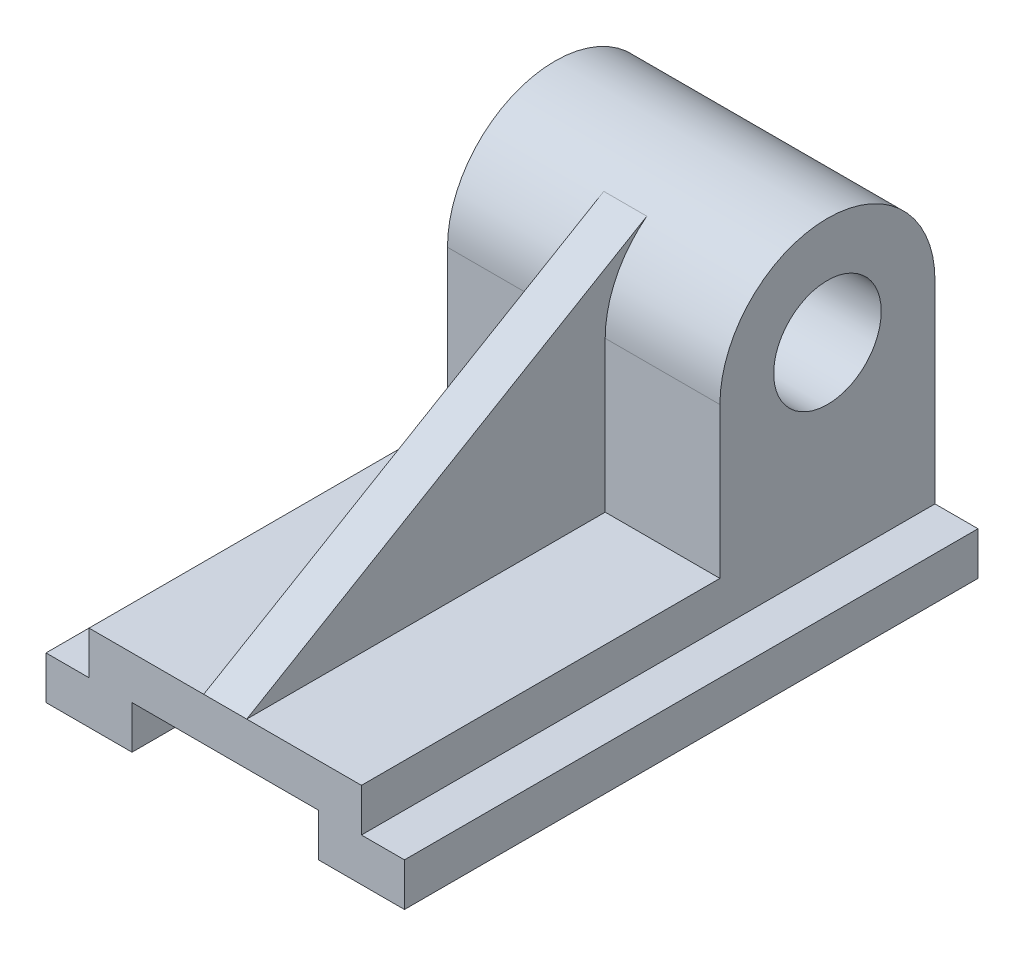
ISO-10303-21;
HEADER;
FILE_DESCRIPTION(('STEP AP214'),'2;1');
FILE_NAME('part.step','',(''),(''),'','','');
FILE_SCHEMA(('AUTOMOTIVE_DESIGN { 1 0 10303 214 1 1 1 1 }'));
ENDSEC;
DATA;
#1=APPLICATION_CONTEXT('core data for automotive mechanical design processes');
#2=APPLICATION_PROTOCOL_DEFINITION('international standard','automotive_design',2000,#1);
#3=PRODUCT_CONTEXT('',#1,'mechanical');
#4=PRODUCT('Part','Part','',(#3));
#5=PRODUCT_RELATED_PRODUCT_CATEGORY('part','',(#4));
#6=PRODUCT_DEFINITION_FORMATION('','',#4);
#7=PRODUCT_DEFINITION_CONTEXT('part definition',#1,'design');
#8=PRODUCT_DEFINITION('design','',#6,#7);
#9=PRODUCT_DEFINITION_SHAPE('','',#8);
#10=(LENGTH_UNIT() NAMED_UNIT(*) SI_UNIT(.MILLI.,.METRE.));
#11=(NAMED_UNIT(*) PLANE_ANGLE_UNIT() SI_UNIT($,.RADIAN.));
#12=(NAMED_UNIT(*) SI_UNIT($,.STERADIAN.) SOLID_ANGLE_UNIT());
#13=UNCERTAINTY_MEASURE_WITH_UNIT(LENGTH_MEASURE(1.E-05),#10,'distance_accuracy_value','');
#14=(GEOMETRIC_REPRESENTATION_CONTEXT(3) GLOBAL_UNCERTAINTY_ASSIGNED_CONTEXT((#13)) GLOBAL_UNIT_ASSIGNED_CONTEXT((#10,
#11,#12)) REPRESENTATION_CONTEXT('',''));
#15=CARTESIAN_POINT('',(0.,0.,0.));
#16=DIRECTION('',(0.,0.,1.));
#17=DIRECTION('',(1.,0.,0.));
#18=AXIS2_PLACEMENT_3D('',#15,#16,#17);
#19=CARTESIAN_POINT('',(0.,180.,-800.));
#20=DIRECTION('',(0.,-1.,0.));
#21=DIRECTION('',(0.,0.,-1.));
#22=AXIS2_PLACEMENT_3D('',#19,#20,#21);
#23=PLANE('',#22);
#24=DIRECTION('',(0.,0.,1.));
#25=VECTOR('',#24,1.);
#26=CARTESIAN_POINT('',(-60.,180.,-800.));
#27=LINE('',#26,#25);
#28=CARTESIAN_POINT('',(-60.0000000000001,180.,-200.));
#29=VERTEX_POINT('',#28);
#30=CARTESIAN_POINT('',(-60.,180.,800.));
#31=VERTEX_POINT('',#30);
#32=EDGE_CURVE('E158',#29,#31,#27,.T.);
#33=ORIENTED_EDGE('',*,*,#32,.F.);
#34=DIRECTION('',(1.,0.,0.));
#35=VECTOR('',#34,1.);
#36=CARTESIAN_POINT('',(-1317.2299611088,180.,-200.));
#37=LINE('',#36,#35);
#38=CARTESIAN_POINT('',(-380.,180.,-200.));
#39=VERTEX_POINT('',#38);
#40=EDGE_CURVE('E58',#39,#29,#37,.T.);
#41=ORIENTED_EDGE('',*,*,#40,.F.);
#42=DIRECTION('',(0.,0.,1.));
#43=VECTOR('',#42,1.);
#44=CARTESIAN_POINT('',(-380.,180.,-800.));
#45=LINE('',#44,#43);
#46=CARTESIAN_POINT('',(-380.,180.,800.));
#47=VERTEX_POINT('',#46);
#48=EDGE_CURVE('E186',#39,#47,#45,.T.);
#49=ORIENTED_EDGE('',*,*,#48,.T.);
#50=DIRECTION('',(1.,0.,0.));
#51=VECTOR('',#50,1.);
#52=CARTESIAN_POINT('',(0.,180.,800.));
#53=LINE('',#52,#51);
#54=EDGE_CURVE('E180',#47,#31,#53,.T.);
#55=ORIENTED_EDGE('',*,*,#54,.T.);
#56=EDGE_LOOP('',(#33,#41,#49,#55));
#57=FACE_BOUND('',#56,.T.);
#58=ADVANCED_FACE('F35',(#57),#23,.F.);
#59=CARTESIAN_POINT('',(-1317.2299611088,600.,-200.));
#60=DIRECTION('',(0.,0.,1.));
#61=DIRECTION('',(1.,0.,0.));
#62=AXIS2_PLACEMENT_3D('',#59,#60,#61);
#63=PLANE('',#62);
#64=ORIENTED_EDGE('',*,*,#40,.T.);
#65=DIRECTION('',(0.,1.,0.));
#66=VECTOR('',#65,1.);
#67=CARTESIAN_POINT('',(-60.0000000000001,600.,-200.));
#68=LINE('',#67,#66);
#69=CARTESIAN_POINT('',(-60.0000000000001,600.,-200.));
#70=VERTEX_POINT('',#69);
#71=EDGE_CURVE('E162',#29,#70,#68,.T.);
#72=ORIENTED_EDGE('',*,*,#71,.T.);
#73=DIRECTION('',(1.,0.,0.));
#74=VECTOR('',#73,1.);
#75=CARTESIAN_POINT('',(-1317.2299611088,600.,-200.));
#76=LINE('',#75,#74);
#77=CARTESIAN_POINT('',(-380.,600.,-200.));
#78=VERTEX_POINT('',#77);
#79=EDGE_CURVE('E340',#78,#70,#76,.T.);
#80=ORIENTED_EDGE('',*,*,#79,.F.);
#81=DIRECTION('',(0.,1.,0.));
#82=VECTOR('',#81,1.);
#83=CARTESIAN_POINT('',(-380.,600.,-200.));
#84=LINE('',#83,#82);
#85=EDGE_CURVE('E261',#39,#78,#84,.T.);
#86=ORIENTED_EDGE('',*,*,#85,.F.);
#87=EDGE_LOOP('',(#64,#72,#80,#86));
#88=FACE_BOUND('',#87,.T.);
#89=ADVANCED_FACE('F368',(#88),#63,.T.);
#90=CARTESIAN_POINT('',(60.0000000000001,180.,-200.));
#91=VERTEX_POINT('',#90);
#92=CARTESIAN_POINT('',(380.,180.,-200.));
#93=VERTEX_POINT('',#92);
#94=EDGE_CURVE('E348',#91,#93,#37,.T.);
#95=ORIENTED_EDGE('',*,*,#94,.F.);
#96=DIRECTION('',(0.,0.,1.));
#97=VECTOR('',#96,1.);
#98=CARTESIAN_POINT('',(60.,180.,-800.));
#99=LINE('',#98,#97);
#100=CARTESIAN_POINT('',(60.,180.,800.));
#101=VERTEX_POINT('',#100);
#102=EDGE_CURVE('E184',#91,#101,#99,.T.);
#103=ORIENTED_EDGE('',*,*,#102,.T.);
#104=CARTESIAN_POINT('',(380.,180.,800.));
#105=VERTEX_POINT('',#104);
#106=EDGE_CURVE('E182',#101,#105,#53,.T.);
#107=ORIENTED_EDGE('',*,*,#106,.T.);
#108=DIRECTION('',(0.,0.,1.));
#109=VECTOR('',#108,1.);
#110=CARTESIAN_POINT('',(380.,180.,-800.));
#111=LINE('',#110,#109);
#112=EDGE_CURVE('E239',#93,#105,#111,.T.);
#113=ORIENTED_EDGE('',*,*,#112,.F.);
#114=EDGE_LOOP('',(#95,#103,#107,#113));
#115=FACE_BOUND('',#114,.T.);
#116=ADVANCED_FACE('F357',(#115),#23,.F.);
#117=CARTESIAN_POINT('',(0.,60.,-800.));
#118=DIRECTION('',(0.,-1.,0.));
#119=DIRECTION('',(1.,0.,0.));
#120=AXIS2_PLACEMENT_3D('',#117,#118,#119);
#121=PLANE('',#120);
#122=DIRECTION('',(1.,0.,0.));
#123=VECTOR('',#122,1.);
#124=CARTESIAN_POINT('',(0.,60.,800.));
#125=LINE('',#124,#123);
#126=CARTESIAN_POINT('',(380.,60.,800.));
#127=VERTEX_POINT('',#126);
#128=CARTESIAN_POINT('',(500.,60.,800.));
#129=VERTEX_POINT('',#128);
#130=EDGE_CURVE('E257',#127,#129,#125,.T.);
#131=ORIENTED_EDGE('',*,*,#130,.T.);
#132=DIRECTION('',(0.,0.,1.));
#133=VECTOR('',#132,1.);
#134=CARTESIAN_POINT('',(500.,60.,-800.));
#135=LINE('',#134,#133);
#136=CARTESIAN_POINT('',(500.,60.,-800.));
#137=VERTEX_POINT('',#136);
#138=EDGE_CURVE('E43',#137,#129,#135,.T.);
#139=ORIENTED_EDGE('',*,*,#138,.F.);
#140=DIRECTION('',(1.,0.,0.));
#141=VECTOR('',#140,1.);
#142=CARTESIAN_POINT('',(0.,60.,-800.));
#143=LINE('',#142,#141);
#144=CARTESIAN_POINT('',(380.,60.,-800.));
#145=VERTEX_POINT('',#144);
#146=EDGE_CURVE('E216',#145,#137,#143,.T.);
#147=ORIENTED_EDGE('',*,*,#146,.F.);
#148=DIRECTION('',(0.,0.,1.));
#149=VECTOR('',#148,1.);
#150=CARTESIAN_POINT('',(380.,60.,-800.));
#151=LINE('',#150,#149);
#152=EDGE_CURVE('E241',#145,#127,#151,.T.);
#153=ORIENTED_EDGE('',*,*,#152,.T.);
#154=EDGE_LOOP('',(#131,#139,#147,#153));
#155=FACE_BOUND('',#154,.T.);
#156=ADVANCED_FACE('F37',(#155),#121,.F.);
#157=CARTESIAN_POINT('',(500.,4.62592926927149E-13,-800.));
#158=DIRECTION('',(-1.,0.,0.));
#159=DIRECTION('',(0.,-1.,0.));
#160=AXIS2_PLACEMENT_3D('',#157,#158,#159);
#161=PLANE('',#160);
#162=DIRECTION('',(0.,-1.,0.));
#163=VECTOR('',#162,1.);
#164=CARTESIAN_POINT('',(500.,4.62592926927149E-13,800.));
#165=LINE('',#164,#163);
#166=CARTESIAN_POINT('',(500.,-60.,800.));
#167=VERTEX_POINT('',#166);
#168=EDGE_CURVE('E214',#129,#167,#165,.T.);
#169=ORIENTED_EDGE('',*,*,#168,.T.);
#170=DIRECTION('',(0.,0.,1.));
#171=VECTOR('',#170,1.);
#172=CARTESIAN_POINT('',(500.,-60.,-800.));
#173=LINE('',#172,#171);
#174=CARTESIAN_POINT('',(500.,-60.,-800.));
#175=VERTEX_POINT('',#174);
#176=EDGE_CURVE('E219',#175,#167,#173,.T.);
#177=ORIENTED_EDGE('',*,*,#176,.F.);
#178=DIRECTION('',(0.,-1.,0.));
#179=VECTOR('',#178,1.);
#180=CARTESIAN_POINT('',(500.,4.62592926927149E-13,-800.));
#181=LINE('',#180,#179);
#182=EDGE_CURVE('E243',#137,#175,#181,.T.);
#183=ORIENTED_EDGE('',*,*,#182,.F.);
#184=ORIENTED_EDGE('',*,*,#138,.T.);
#185=EDGE_LOOP('',(#169,#177,#183,#184));
#186=FACE_BOUND('',#185,.T.);
#187=ADVANCED_FACE('F361',(#186),#161,.F.);
#188=CARTESIAN_POINT('',(0.,-60.,-800.));
#189=DIRECTION('',(0.,1.,0.));
#190=DIRECTION('',(-1.,0.,0.));
#191=AXIS2_PLACEMENT_3D('',#188,#189,#190);
#192=PLANE('',#191);
#193=DIRECTION('',(-1.,0.,0.));
#194=VECTOR('',#193,1.);
#195=CARTESIAN_POINT('',(0.,-60.,800.));
#196=LINE('',#195,#194);
#197=CARTESIAN_POINT('',(260.,-60.,800.));
#198=VERTEX_POINT('',#197);
#199=EDGE_CURVE('E211',#167,#198,#196,.T.);
#200=ORIENTED_EDGE('',*,*,#199,.T.);
#201=DIRECTION('',(0.,0.,1.));
#202=VECTOR('',#201,1.);
#203=CARTESIAN_POINT('',(260.,-60.,-800.));
#204=LINE('',#203,#202);
#205=CARTESIAN_POINT('',(260.,-60.,-800.));
#206=VERTEX_POINT('',#205);
#207=EDGE_CURVE('E222',#206,#198,#204,.T.);
#208=ORIENTED_EDGE('',*,*,#207,.F.);
#209=DIRECTION('',(-1.,0.,0.));
#210=VECTOR('',#209,1.);
#211=CARTESIAN_POINT('',(0.,-60.,-800.));
#212=LINE('',#211,#210);
#213=EDGE_CURVE('E249',#175,#206,#212,.T.);
#214=ORIENTED_EDGE('',*,*,#213,.F.);
#215=ORIENTED_EDGE('',*,*,#176,.T.);
#216=EDGE_LOOP('',(#200,#208,#214,#215));
#217=FACE_BOUND('',#216,.T.);
#218=ADVANCED_FACE('F299',(#217),#192,.F.);
#219=CARTESIAN_POINT('',(260.,0.,-800.));
#220=DIRECTION('',(-1.,0.,0.));
#221=DIRECTION('',(0.,0.,1.));
#222=AXIS2_PLACEMENT_3D('',#219,#220,#221);
#223=PLANE('',#222);
#224=DIRECTION('',(0.,-1.,0.));
#225=VECTOR('',#224,1.);
#226=CARTESIAN_POINT('',(260.,0.,800.));
#227=LINE('',#226,#225);
#228=CARTESIAN_POINT('',(260.,60.,800.));
#229=VERTEX_POINT('',#228);
#230=EDGE_CURVE('E208',#229,#198,#227,.T.);
#231=ORIENTED_EDGE('',*,*,#230,.F.);
#232=DIRECTION('',(0.,0.,1.));
#233=VECTOR('',#232,1.);
#234=CARTESIAN_POINT('',(260.,60.,-800.));
#235=LINE('',#234,#233);
#236=CARTESIAN_POINT('',(260.,60.,-800.));
#237=VERTEX_POINT('',#236);
#238=EDGE_CURVE('E224',#237,#229,#235,.T.);
#239=ORIENTED_EDGE('',*,*,#238,.F.);
#240=DIRECTION('',(0.,-1.,0.));
#241=VECTOR('',#240,1.);
#242=CARTESIAN_POINT('',(260.,0.,-800.));
#243=LINE('',#242,#241);
#244=EDGE_CURVE('E254',#237,#206,#243,.T.);
#245=ORIENTED_EDGE('',*,*,#244,.T.);
#246=ORIENTED_EDGE('',*,*,#207,.T.);
#247=EDGE_LOOP('',(#231,#239,#245,#246));
#248=FACE_BOUND('',#247,.T.);
#249=ADVANCED_FACE('F292',(#248),#223,.T.);
#250=CARTESIAN_POINT('',(0.,60.,-800.));
#251=DIRECTION('',(0.,-1.,0.));
#252=DIRECTION('',(1.,0.,0.));
#253=AXIS2_PLACEMENT_3D('',#250,#251,#252);
#254=PLANE('',#253);
#255=ORIENTED_EDGE('',*,*,#238,.T.);
#256=DIRECTION('',(1.,0.,0.));
#257=VECTOR('',#256,1.);
#258=CARTESIAN_POINT('',(0.,60.,800.));
#259=LINE('',#258,#257);
#260=CARTESIAN_POINT('',(-260.,59.9999999999999,800.));
#261=VERTEX_POINT('',#260);
#262=EDGE_CURVE('E206',#261,#229,#259,.T.);
#263=ORIENTED_EDGE('',*,*,#262,.F.);
#264=DIRECTION('',(0.,0.,1.));
#265=VECTOR('',#264,1.);
#266=CARTESIAN_POINT('',(-260.,59.9999999999999,-800.));
#267=LINE('',#266,#265);
#268=CARTESIAN_POINT('',(-260.,59.9999999999999,-800.));
#269=VERTEX_POINT('',#268);
#270=EDGE_CURVE('E227',#269,#261,#267,.T.);
#271=ORIENTED_EDGE('',*,*,#270,.F.);
#272=DIRECTION('',(1.,0.,0.));
#273=VECTOR('',#272,1.);
#274=CARTESIAN_POINT('',(0.,60.,-800.));
#275=LINE('',#274,#273);
#276=EDGE_CURVE('E286',#269,#237,#275,.T.);
#277=ORIENTED_EDGE('',*,*,#276,.T.);
#278=EDGE_LOOP('',(#255,#263,#271,#277));
#279=FACE_BOUND('',#278,.T.);
#280=ADVANCED_FACE('F305',(#279),#254,.T.);
#281=CARTESIAN_POINT('',(-260.,0.,-800.));
#282=DIRECTION('',(1.,0.,0.));
#283=DIRECTION('',(0.,0.,-1.));
#284=AXIS2_PLACEMENT_3D('',#281,#282,#283);
#285=PLANE('',#284);
#286=DIRECTION('',(0.,1.,0.));
#287=VECTOR('',#286,1.);
#288=CARTESIAN_POINT('',(-260.,0.,800.));
#289=LINE('',#288,#287);
#290=CARTESIAN_POINT('',(-260.,-60.0000000000001,800.));
#291=VERTEX_POINT('',#290);
#292=EDGE_CURVE('E203',#291,#261,#289,.T.);
#293=ORIENTED_EDGE('',*,*,#292,.F.);
#294=DIRECTION('',(0.,0.,1.));
#295=VECTOR('',#294,1.);
#296=CARTESIAN_POINT('',(-260.,-60.0000000000001,-800.));
#297=LINE('',#296,#295);
#298=CARTESIAN_POINT('',(-260.,-60.0000000000001,-800.));
#299=VERTEX_POINT('',#298);
#300=EDGE_CURVE('E229',#299,#291,#297,.T.);
#301=ORIENTED_EDGE('',*,*,#300,.F.);
#302=DIRECTION('',(0.,1.,0.));
#303=VECTOR('',#302,1.);
#304=CARTESIAN_POINT('',(-260.,0.,-800.));
#305=LINE('',#304,#303);
#306=EDGE_CURVE('E283',#299,#269,#305,.T.);
#307=ORIENTED_EDGE('',*,*,#306,.T.);
#308=ORIENTED_EDGE('',*,*,#270,.T.);
#309=EDGE_LOOP('',(#293,#301,#307,#308));
#310=FACE_BOUND('',#309,.T.);
#311=ADVANCED_FACE('F307',(#310),#285,.T.);
#312=CARTESIAN_POINT('',(0.,-60.,-800.));
#313=DIRECTION('',(0.,1.,0.));
#314=DIRECTION('',(-1.,0.,0.));
#315=AXIS2_PLACEMENT_3D('',#312,#313,#314);
#316=PLANE('',#315);
#317=DIRECTION('',(-1.,0.,0.));
#318=VECTOR('',#317,1.);
#319=CARTESIAN_POINT('',(0.,-60.,800.));
#320=LINE('',#319,#318);
#321=CARTESIAN_POINT('',(-500.,-60.0000000000001,800.));
#322=VERTEX_POINT('',#321);
#323=EDGE_CURVE('E200',#291,#322,#320,.T.);
#324=ORIENTED_EDGE('',*,*,#323,.T.);
#325=DIRECTION('',(0.,0.,1.));
#326=VECTOR('',#325,1.);
#327=CARTESIAN_POINT('',(-500.,-60.0000000000001,-800.));
#328=LINE('',#327,#326);
#329=CARTESIAN_POINT('',(-500.,-60.0000000000001,-800.));
#330=VERTEX_POINT('',#329);
#331=EDGE_CURVE('E231',#330,#322,#328,.T.);
#332=ORIENTED_EDGE('',*,*,#331,.F.);
#333=DIRECTION('',(-1.,0.,0.));
#334=VECTOR('',#333,1.);
#335=CARTESIAN_POINT('',(0.,-60.,-800.));
#336=LINE('',#335,#334);
#337=EDGE_CURVE('E281',#299,#330,#336,.T.);
#338=ORIENTED_EDGE('',*,*,#337,.F.);
#339=ORIENTED_EDGE('',*,*,#300,.T.);
#340=EDGE_LOOP('',(#324,#332,#338,#339));
#341=FACE_BOUND('',#340,.T.);
#342=ADVANCED_FACE('F312',(#341),#316,.F.);
#343=CARTESIAN_POINT('',(-500.,-2.31296463463574E-13,-800.));
#344=DIRECTION('',(-1.,0.,0.));
#345=DIRECTION('',(0.,-1.,0.));
#346=AXIS2_PLACEMENT_3D('',#343,#344,#345);
#347=PLANE('',#346);
#348=DIRECTION('',(0.,-1.,0.));
#349=VECTOR('',#348,1.);
#350=CARTESIAN_POINT('',(-500.,-2.31296463463574E-13,800.));
#351=LINE('',#350,#349);
#352=CARTESIAN_POINT('',(-500.,59.9999999999999,800.));
#353=VERTEX_POINT('',#352);
#354=EDGE_CURVE('E197',#353,#322,#351,.T.);
#355=ORIENTED_EDGE('',*,*,#354,.F.);
#356=DIRECTION('',(0.,0.,1.));
#357=VECTOR('',#356,1.);
#358=CARTESIAN_POINT('',(-500.,59.9999999999999,-800.));
#359=LINE('',#358,#357);
#360=CARTESIAN_POINT('',(-500.,59.9999999999999,-800.));
#361=VERTEX_POINT('',#360);
#362=EDGE_CURVE('E233',#361,#353,#359,.T.);
#363=ORIENTED_EDGE('',*,*,#362,.F.);
#364=DIRECTION('',(0.,-1.,0.));
#365=VECTOR('',#364,1.);
#366=CARTESIAN_POINT('',(-500.,-2.31296463463574E-13,-800.));
#367=LINE('',#366,#365);
#368=EDGE_CURVE('E278',#361,#330,#367,.T.);
#369=ORIENTED_EDGE('',*,*,#368,.T.);
#370=ORIENTED_EDGE('',*,*,#331,.T.);
#371=EDGE_LOOP('',(#355,#363,#369,#370));
#372=FACE_BOUND('',#371,.T.);
#373=ADVANCED_FACE('F315',(#372),#347,.T.);
#374=CARTESIAN_POINT('',(0.,60.,-800.));
#375=DIRECTION('',(0.,-1.,0.));
#376=DIRECTION('',(1.,0.,0.));
#377=AXIS2_PLACEMENT_3D('',#374,#375,#376);
#378=PLANE('',#377);
#379=DIRECTION('',(1.,0.,0.));
#380=VECTOR('',#379,1.);
#381=CARTESIAN_POINT('',(0.,60.,800.));
#382=LINE('',#381,#380);
#383=CARTESIAN_POINT('',(-380.,59.9999999999999,800.));
#384=VERTEX_POINT('',#383);
#385=EDGE_CURVE('E190',#353,#384,#382,.T.);
#386=ORIENTED_EDGE('',*,*,#385,.T.);
#387=DIRECTION('',(0.,0.,1.));
#388=VECTOR('',#387,1.);
#389=CARTESIAN_POINT('',(-380.,59.9999999999999,-800.));
#390=LINE('',#389,#388);
#391=CARTESIAN_POINT('',(-380.,59.9999999999999,-800.));
#392=VERTEX_POINT('',#391);
#393=EDGE_CURVE('E235',#392,#384,#390,.T.);
#394=ORIENTED_EDGE('',*,*,#393,.F.);
#395=DIRECTION('',(1.,0.,0.));
#396=VECTOR('',#395,1.);
#397=CARTESIAN_POINT('',(0.,60.,-800.));
#398=LINE('',#397,#396);
#399=EDGE_CURVE('E276',#361,#392,#398,.T.);
#400=ORIENTED_EDGE('',*,*,#399,.F.);
#401=ORIENTED_EDGE('',*,*,#362,.T.);
#402=EDGE_LOOP('',(#386,#394,#400,#401));
#403=FACE_BOUND('',#402,.T.);
#404=ADVANCED_FACE('F320',(#403),#378,.F.);
#405=CARTESIAN_POINT('',(-380.,0.,-800.));
#406=DIRECTION('',(1.,0.,0.));
#407=DIRECTION('',(0.,0.,-1.));
#408=AXIS2_PLACEMENT_3D('',#405,#406,#407);
#409=PLANE('',#408);
#410=DIRECTION('',(0.,1.,0.));
#411=VECTOR('',#410,1.);
#412=CARTESIAN_POINT('',(-380.,0.,800.));
#413=LINE('',#412,#411);
#414=EDGE_CURVE('E188',#384,#47,#413,.T.);
#415=ORIENTED_EDGE('',*,*,#414,.T.);
#416=ORIENTED_EDGE('',*,*,#48,.F.);
#417=ORIENTED_EDGE('',*,*,#85,.T.);
#418=CARTESIAN_POINT('',(-380.,600.,-500.));
#419=DIRECTION('',(1.,0.,0.));
#420=DIRECTION('',(0.,0.,-1.));
#421=AXIS2_PLACEMENT_3D('',#418,#419,#420);
#422=CIRCLE('',#421,300.);
#423=CARTESIAN_POINT('',(-380.,600.,-800.));
#424=VERTEX_POINT('',#423);
#425=EDGE_CURVE('E265',#78,#424,#422,.F.);
#426=ORIENTED_EDGE('',*,*,#425,.T.);
#427=DIRECTION('',(0.,1.,0.));
#428=VECTOR('',#427,1.);
#429=CARTESIAN_POINT('',(-380.,0.,-800.));
#430=LINE('',#429,#428);
#431=EDGE_CURVE('E274',#392,#424,#430,.T.);
#432=ORIENTED_EDGE('',*,*,#431,.F.);
#433=ORIENTED_EDGE('',*,*,#393,.T.);
#434=EDGE_LOOP('',(#415,#416,#417,#426,#432,#433));
#435=FACE_BOUND('',#434,.T.);
#436=CARTESIAN_POINT('',(-380.,600.,-500.));
#437=DIRECTION('',(1.,0.,0.));
#438=DIRECTION('',(0.,0.,-1.));
#439=AXIS2_PLACEMENT_3D('',#436,#437,#438);
#440=CIRCLE('',#439,150.);
#441=CARTESIAN_POINT('',(-380.,600.,-650.));
#442=VERTEX_POINT('',#441);
#443=EDGE_CURVE('E258',#442,#442,#440,.F.);
#444=ORIENTED_EDGE('',*,*,#443,.F.);
#445=EDGE_LOOP('',(#444));
#446=FACE_BOUND('',#445,.T.);
#447=ADVANCED_FACE('F327',(#435,#446),#409,.F.);
#448=CARTESIAN_POINT('',(380.,0.,-800.));
#449=DIRECTION('',(-1.,0.,0.));
#450=DIRECTION('',(0.,0.,1.));
#451=AXIS2_PLACEMENT_3D('',#448,#449,#450);
#452=PLANE('',#451);
#453=DIRECTION('',(0.,-1.,0.));
#454=VECTOR('',#453,1.);
#455=CARTESIAN_POINT('',(380.,0.,800.));
#456=LINE('',#455,#454);
#457=EDGE_CURVE('E192',#105,#127,#456,.T.);
#458=ORIENTED_EDGE('',*,*,#457,.T.);
#459=ORIENTED_EDGE('',*,*,#152,.F.);
#460=DIRECTION('',(0.,-1.,0.));
#461=VECTOR('',#460,1.);
#462=CARTESIAN_POINT('',(380.,0.,-800.));
#463=LINE('',#462,#461);
#464=CARTESIAN_POINT('',(380.,600.,-800.));
#465=VERTEX_POINT('',#464);
#466=EDGE_CURVE('E272',#465,#145,#463,.T.);
#467=ORIENTED_EDGE('',*,*,#466,.F.);
#468=CARTESIAN_POINT('',(380.,600.,-500.));
#469=DIRECTION('',(1.,0.,0.));
#470=DIRECTION('',(0.,0.,-1.));
#471=AXIS2_PLACEMENT_3D('',#468,#469,#470);
#472=CIRCLE('',#471,300.);
#473=CARTESIAN_POINT('',(380.,600.,-200.));
#474=VERTEX_POINT('',#473);
#475=EDGE_CURVE('E337',#465,#474,#472,.T.);
#476=ORIENTED_EDGE('',*,*,#475,.T.);
#477=DIRECTION('',(0.,-1.,0.));
#478=VECTOR('',#477,1.);
#479=CARTESIAN_POINT('',(380.,600.,-200.));
#480=LINE('',#479,#478);
#481=EDGE_CURVE('E339',#474,#93,#480,.T.);
#482=ORIENTED_EDGE('',*,*,#481,.T.);
#483=ORIENTED_EDGE('',*,*,#112,.T.);
#484=EDGE_LOOP('',(#458,#459,#467,#476,#482,#483));
#485=FACE_BOUND('',#484,.T.);
#486=CARTESIAN_POINT('',(380.,600.,-500.));
#487=DIRECTION('',(1.,0.,0.));
#488=DIRECTION('',(0.,0.,-1.));
#489=AXIS2_PLACEMENT_3D('',#486,#487,#488);
#490=CIRCLE('',#489,150.);
#491=CARTESIAN_POINT('',(380.,600.,-650.));
#492=VERTEX_POINT('',#491);
#493=EDGE_CURVE('E183',#492,#492,#490,.T.);
#494=ORIENTED_EDGE('',*,*,#493,.F.);
#495=EDGE_LOOP('',(#494));
#496=FACE_BOUND('',#495,.T.);
#497=ADVANCED_FACE('F358',(#485,#496),#452,.F.);
#498=CARTESIAN_POINT('',(0.,0.,-800.));
#499=DIRECTION('',(0.,0.,1.));
#500=DIRECTION('',(1.,0.,0.));
#501=AXIS2_PLACEMENT_3D('',#498,#499,#500);
#502=PLANE('',#501);
#503=ORIENTED_EDGE('',*,*,#244,.F.);
#504=ORIENTED_EDGE('',*,*,#276,.F.);
#505=ORIENTED_EDGE('',*,*,#306,.F.);
#506=ORIENTED_EDGE('',*,*,#337,.T.);
#507=ORIENTED_EDGE('',*,*,#368,.F.);
#508=ORIENTED_EDGE('',*,*,#399,.T.);
#509=ORIENTED_EDGE('',*,*,#431,.T.);
#510=DIRECTION('',(1.,0.,0.));
#511=VECTOR('',#510,1.);
#512=CARTESIAN_POINT('',(-1317.2299611088,600.,-800.));
#513=LINE('',#512,#511);
#514=EDGE_CURVE('E269',#424,#465,#513,.T.);
#515=ORIENTED_EDGE('',*,*,#514,.T.);
#516=ORIENTED_EDGE('',*,*,#466,.T.);
#517=ORIENTED_EDGE('',*,*,#146,.T.);
#518=ORIENTED_EDGE('',*,*,#182,.T.);
#519=ORIENTED_EDGE('',*,*,#213,.T.);
#520=EDGE_LOOP('',(#503,#504,#505,#506,#507,#508,#509,#515,#516,#517,#518,#519));
#521=FACE_BOUND('',#520,.T.);
#522=ADVANCED_FACE('F295',(#521),#502,.F.);
#523=CARTESIAN_POINT('',(0.,0.,800.));
#524=DIRECTION('',(0.,0.,1.));
#525=DIRECTION('',(1.,0.,0.));
#526=AXIS2_PLACEMENT_3D('',#523,#524,#525);
#527=PLANE('',#526);
#528=ORIENTED_EDGE('',*,*,#106,.F.);
#529=DIRECTION('',(1.,0.,0.));
#530=VECTOR('',#529,1.);
#531=CARTESIAN_POINT('',(0.,180.,800.));
#532=LINE('',#531,#530);
#533=EDGE_CURVE('E170',#101,#31,#532,.F.);
#534=ORIENTED_EDGE('',*,*,#533,.T.);
#535=ORIENTED_EDGE('',*,*,#54,.F.);
#536=ORIENTED_EDGE('',*,*,#414,.F.);
#537=ORIENTED_EDGE('',*,*,#385,.F.);
#538=ORIENTED_EDGE('',*,*,#354,.T.);
#539=ORIENTED_EDGE('',*,*,#323,.F.);
#540=ORIENTED_EDGE('',*,*,#292,.T.);
#541=ORIENTED_EDGE('',*,*,#262,.T.);
#542=ORIENTED_EDGE('',*,*,#230,.T.);
#543=ORIENTED_EDGE('',*,*,#199,.F.);
#544=ORIENTED_EDGE('',*,*,#168,.F.);
#545=ORIENTED_EDGE('',*,*,#130,.F.);
#546=ORIENTED_EDGE('',*,*,#457,.F.);
#547=EDGE_LOOP('',(#528,#534,#535,#536,#537,#538,#539,#540,#541,#542,#543,#544,#545,#546));
#548=FACE_BOUND('',#547,.T.);
#549=ADVANCED_FACE('F178',(#548),#527,.T.);
#550=CARTESIAN_POINT('',(-1317.2299611088,600.,-500.));
#551=DIRECTION('',(1.,0.,0.));
#552=DIRECTION('',(0.,0.,-1.));
#553=AXIS2_PLACEMENT_3D('',#550,#551,#552);
#554=CYLINDRICAL_SURFACE('',#553,300.);
#555=ORIENTED_EDGE('',*,*,#475,.F.);
#556=ORIENTED_EDGE('',*,*,#514,.F.);
#557=ORIENTED_EDGE('',*,*,#425,.F.);
#558=ORIENTED_EDGE('',*,*,#79,.T.);
#559=CARTESIAN_POINT('',(-60.0000000000001,600.,-500.));
#560=DIRECTION('',(1.,0.,0.));
#561=DIRECTION('',(0.,0.,-1.));
#562=AXIS2_PLACEMENT_3D('',#559,#560,#561);
#563=CIRCLE('',#562,300.);
#564=CARTESIAN_POINT('',(-60.0000000000001,837.02099990827,-316.095009305121));
#565=VERTEX_POINT('',#564);
#566=EDGE_CURVE('E50',#70,#565,#563,.F.);
#567=ORIENTED_EDGE('',*,*,#566,.T.);
#568=DIRECTION('',(1.,0.,0.));
#569=VECTOR('',#568,1.);
#570=CARTESIAN_POINT('',(-1317.2299611088,837.020999908271,-316.095009305121));
#571=LINE('',#570,#569);
#572=CARTESIAN_POINT('',(60.0000000000001,837.02099990827,-316.095009305121));
#573=VERTEX_POINT('',#572);
#574=EDGE_CURVE('E11',#573,#565,#571,.F.);
#575=ORIENTED_EDGE('',*,*,#574,.F.);
#576=CARTESIAN_POINT('',(60.0000000000001,600.,-500.));
#577=DIRECTION('',(1.,0.,0.));
#578=DIRECTION('',(0.,0.,-1.));
#579=AXIS2_PLACEMENT_3D('',#576,#577,#578);
#580=CIRCLE('',#579,300.);
#581=CARTESIAN_POINT('',(60.0000000000001,600.,-200.));
#582=VERTEX_POINT('',#581);
#583=EDGE_CURVE('E421',#582,#573,#580,.F.);
#584=ORIENTED_EDGE('',*,*,#583,.F.);
#585=EDGE_CURVE('E338',#582,#474,#76,.T.);
#586=ORIENTED_EDGE('',*,*,#585,.T.);
#587=EDGE_LOOP('',(#555,#556,#557,#558,#567,#575,#584,#586));
#588=FACE_BOUND('',#587,.T.);
#589=ADVANCED_FACE('F335',(#588),#554,.T.);
#590=DIRECTION('',(0.,1.,0.));
#591=VECTOR('',#590,1.);
#592=CARTESIAN_POINT('',(60.0000000000001,600.,-200.));
#593=LINE('',#592,#591);
#594=EDGE_CURVE('E164',#91,#582,#593,.T.);
#595=ORIENTED_EDGE('',*,*,#594,.F.);
#596=ORIENTED_EDGE('',*,*,#94,.T.);
#597=ORIENTED_EDGE('',*,*,#481,.F.);
#598=ORIENTED_EDGE('',*,*,#585,.F.);
#599=EDGE_LOOP('',(#595,#596,#597,#598));
#600=FACE_BOUND('',#599,.T.);
#601=ADVANCED_FACE('F353',(#600),#63,.T.);
#602=CARTESIAN_POINT('',(-1317.2299611088,600.,-500.));
#603=DIRECTION('',(1.,0.,0.));
#604=DIRECTION('',(0.,0.,-1.));
#605=AXIS2_PLACEMENT_3D('',#602,#603,#604);
#606=CYLINDRICAL_SURFACE('',#605,150.);
#607=ORIENTED_EDGE('',*,*,#493,.T.);
#608=EDGE_LOOP('',(#607));
#609=FACE_BOUND('',#608,.T.);
#610=ORIENTED_EDGE('',*,*,#443,.T.);
#611=EDGE_LOOP('',(#610));
#612=FACE_BOUND('',#611,.T.);
#613=ADVANCED_FACE('F407',(#609,#612),#606,.F.);
#614=CARTESIAN_POINT('',(0.,180.,800.));
#615=DIRECTION('',(0.,-0.86176729957638,-0.507303776233564));
#616=DIRECTION('',(0.,0.507303776233564,-0.86176729957638));
#617=AXIS2_PLACEMENT_3D('',#614,#615,#616);
#618=PLANE('',#617);
#619=ORIENTED_EDGE('',*,*,#533,.F.);
#620=DIRECTION('',(0.,0.507303776233564,-0.86176729957638));
#621=VECTOR('',#620,1.);
#622=CARTESIAN_POINT('',(60.,180.,800.));
#623=LINE('',#622,#621);
#624=EDGE_CURVE('E173',#101,#573,#623,.T.);
#625=ORIENTED_EDGE('',*,*,#624,.T.);
#626=ORIENTED_EDGE('',*,*,#574,.T.);
#627=DIRECTION('',(0.,0.507303776233564,-0.86176729957638));
#628=VECTOR('',#627,1.);
#629=CARTESIAN_POINT('',(-60.,180.,800.));
#630=LINE('',#629,#628);
#631=EDGE_CURVE('E161',#31,#565,#630,.T.);
#632=ORIENTED_EDGE('',*,*,#631,.F.);
#633=EDGE_LOOP('',(#619,#625,#626,#632));
#634=FACE_BOUND('',#633,.T.);
#635=ADVANCED_FACE('F168',(#634),#618,.F.);
#636=CARTESIAN_POINT('',(60.,420.,0.));
#637=DIRECTION('',(1.,0.,0.));
#638=DIRECTION('',(0.,0.,-1.));
#639=AXIS2_PLACEMENT_3D('',#636,#637,#638);
#640=PLANE('',#639);
#641=ORIENTED_EDGE('',*,*,#102,.F.);
#642=ORIENTED_EDGE('',*,*,#594,.T.);
#643=ORIENTED_EDGE('',*,*,#583,.T.);
#644=ORIENTED_EDGE('',*,*,#624,.F.);
#645=EDGE_LOOP('',(#641,#642,#643,#644));
#646=FACE_BOUND('',#645,.T.);
#647=ADVANCED_FACE('F413',(#646),#640,.T.);
#648=CARTESIAN_POINT('',(-60.,420.,0.));
#649=DIRECTION('',(1.,0.,0.));
#650=DIRECTION('',(0.,0.,-1.));
#651=AXIS2_PLACEMENT_3D('',#648,#649,#650);
#652=PLANE('',#651);
#653=ORIENTED_EDGE('',*,*,#71,.F.);
#654=ORIENTED_EDGE('',*,*,#32,.T.);
#655=ORIENTED_EDGE('',*,*,#631,.T.);
#656=ORIENTED_EDGE('',*,*,#566,.F.);
#657=EDGE_LOOP('',(#653,#654,#655,#656));
#658=FACE_BOUND('',#657,.T.);
#659=ADVANCED_FACE('F160',(#658),#652,.F.);
#660=CLOSED_SHELL('',(#58,#89,#116,#156,#187,#218,#249,#280,#311,#342,#373,#404,#447,#497,#522,
#549,#589,#601,#613,#635,#647,#659));
#661=MANIFOLD_SOLID_BREP('B2',#660);
#662=ADVANCED_BREP_SHAPE_REPRESENTATION('',(#18,#661),#14);
#663=SHAPE_DEFINITION_REPRESENTATION(#9,#662);
ENDSEC;
END-ISO-10303-21;
